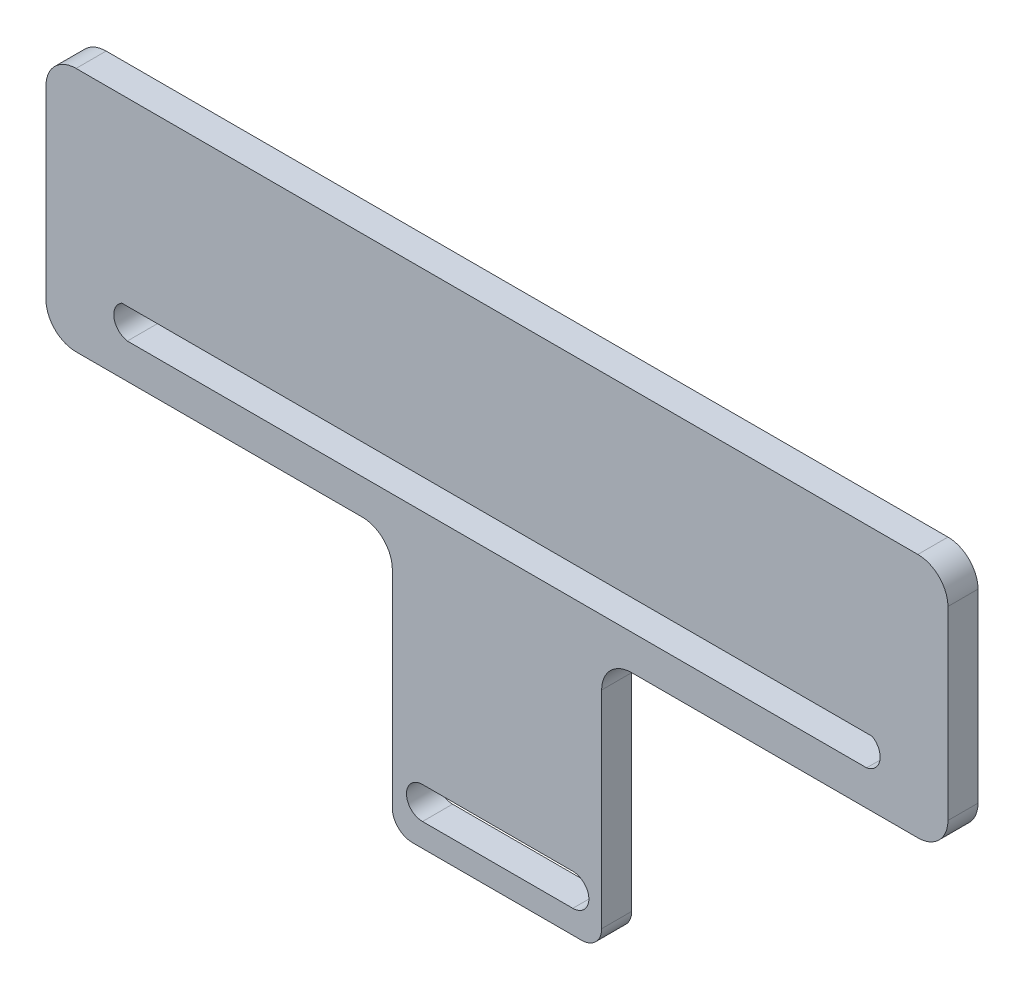
ISO-10303-21;
HEADER;
FILE_DESCRIPTION(('STEP AP214'),'2;1');
FILE_NAME('part.step','',(''),(''),'','','');
FILE_SCHEMA(('AUTOMOTIVE_DESIGN { 1 0 10303 214 1 1 1 1 }'));
ENDSEC;
DATA;
#1=APPLICATION_CONTEXT('core data for automotive mechanical design processes');
#2=APPLICATION_PROTOCOL_DEFINITION('international standard','automotive_design',2000,#1);
#3=PRODUCT_CONTEXT('',#1,'mechanical');
#4=PRODUCT('Part','Part','',(#3));
#5=PRODUCT_RELATED_PRODUCT_CATEGORY('part','',(#4));
#6=PRODUCT_DEFINITION_FORMATION('','',#4);
#7=PRODUCT_DEFINITION_CONTEXT('part definition',#1,'design');
#8=PRODUCT_DEFINITION('design','',#6,#7);
#9=PRODUCT_DEFINITION_SHAPE('','',#8);
#10=(LENGTH_UNIT() NAMED_UNIT(*) SI_UNIT(.MILLI.,.METRE.));
#11=(NAMED_UNIT(*) PLANE_ANGLE_UNIT() SI_UNIT($,.RADIAN.));
#12=(NAMED_UNIT(*) SI_UNIT($,.STERADIAN.) SOLID_ANGLE_UNIT());
#13=UNCERTAINTY_MEASURE_WITH_UNIT(LENGTH_MEASURE(1.E-05),#10,'distance_accuracy_value','');
#14=(GEOMETRIC_REPRESENTATION_CONTEXT(3) GLOBAL_UNCERTAINTY_ASSIGNED_CONTEXT((#13)) GLOBAL_UNIT_ASSIGNED_CONTEXT((#10,
#11,#12)) REPRESENTATION_CONTEXT('',''));
#15=CARTESIAN_POINT('',(0.,0.,0.));
#16=DIRECTION('',(0.,0.,1.));
#17=DIRECTION('',(1.,0.,0.));
#18=AXIS2_PLACEMENT_3D('',#15,#16,#17);
#19=CARTESIAN_POINT('',(13.443741515175,18.7024349270846,3.));
#20=DIRECTION('',(0.,0.,-1.));
#21=DIRECTION('',(-1.,0.,0.));
#22=AXIS2_PLACEMENT_3D('',#19,#20,#21);
#23=PLANE('',#22);
#24=CARTESIAN_POINT('',(-7.43073465550234,0.,3.));
#25=DIRECTION('',(0.,0.,1.));
#26=DIRECTION('',(1.,0.,0.));
#27=AXIS2_PLACEMENT_3D('',#24,#25,#26);
#28=CIRCLE('',#27,1.6);
#29=CARTESIAN_POINT('',(-7.43073465550234,1.6,3.));
#30=VERTEX_POINT('',#29);
#31=CARTESIAN_POINT('',(-7.43073465550234,-1.6,3.));
#32=VERTEX_POINT('',#31);
#33=EDGE_CURVE('E236',#30,#32,#28,.T.);
#34=ORIENTED_EDGE('',*,*,#33,.F.);
#35=DIRECTION('',(-1.,0.,0.));
#36=VECTOR('',#35,1.);
#37=CARTESIAN_POINT('',(-7.43073465550234,1.6,3.));
#38=LINE('',#37,#36);
#39=CARTESIAN_POINT('',(7.56926534449766,1.6,3.));
#40=VERTEX_POINT('',#39);
#41=EDGE_CURVE('E244',#40,#30,#38,.T.);
#42=ORIENTED_EDGE('',*,*,#41,.F.);
#43=CARTESIAN_POINT('',(7.56926534449766,0.,3.));
#44=DIRECTION('',(0.,0.,1.));
#45=DIRECTION('',(1.,0.,0.));
#46=AXIS2_PLACEMENT_3D('',#43,#44,#45);
#47=CIRCLE('',#46,1.6);
#48=CARTESIAN_POINT('',(7.56926534449766,-1.6,3.));
#49=VERTEX_POINT('',#48);
#50=EDGE_CURVE('E241',#49,#40,#47,.T.);
#51=ORIENTED_EDGE('',*,*,#50,.F.);
#52=DIRECTION('',(1.,0.,0.));
#53=VECTOR('',#52,1.);
#54=CARTESIAN_POINT('',(-7.43073465550234,-1.6,3.));
#55=LINE('',#54,#53);
#56=EDGE_CURVE('E238',#32,#49,#55,.T.);
#57=ORIENTED_EDGE('',*,*,#56,.F.);
#58=EDGE_LOOP('',(#34,#42,#51,#57));
#59=FACE_BOUND('',#58,.T.);
#60=DIRECTION('',(0.,1.,0.));
#61=VECTOR('',#60,1.);
#62=CARTESIAN_POINT('',(10.443741515175,1.70243492708456,3.));
#63=LINE('',#62,#61);
#64=CARTESIAN_POINT('',(10.443741515175,-1.92883744754202,3.));
#65=VERTEX_POINT('',#64);
#66=CARTESIAN_POINT('',(10.443741515175,18.7024349270845,3.));
#67=VERTEX_POINT('',#66);
#68=EDGE_CURVE('E267',#65,#67,#63,.T.);
#69=ORIENTED_EDGE('',*,*,#68,.T.);
#70=CARTESIAN_POINT('',(13.443741515175,18.7024349270846,3.));
#71=DIRECTION('',(0.,0.,-1.));
#72=DIRECTION('',(-1.,0.,0.));
#73=AXIS2_PLACEMENT_3D('',#70,#71,#72);
#74=CIRCLE('',#73,3.);
#75=CARTESIAN_POINT('',(13.443741515175,21.7024349270846,3.));
#76=VERTEX_POINT('',#75);
#77=EDGE_CURVE('E270',#67,#76,#74,.T.);
#78=ORIENTED_EDGE('',*,*,#77,.T.);
#79=DIRECTION('',(1.,0.,0.));
#80=VECTOR('',#79,1.);
#81=CARTESIAN_POINT('',(13.443741515175,21.7024349270846,3.));
#82=LINE('',#81,#80);
#83=CARTESIAN_POINT('',(42.,21.7024349270846,3.));
#84=VERTEX_POINT('',#83);
#85=EDGE_CURVE('E273',#76,#84,#82,.T.);
#86=ORIENTED_EDGE('',*,*,#85,.T.);
#87=CARTESIAN_POINT('',(42.,24.7024349270846,3.));
#88=DIRECTION('',(0.,0.,1.));
#89=DIRECTION('',(1.,0.,0.));
#90=AXIS2_PLACEMENT_3D('',#87,#88,#89);
#91=CIRCLE('',#90,3.);
#92=CARTESIAN_POINT('',(45.,24.7024349270846,3.));
#93=VERTEX_POINT('',#92);
#94=EDGE_CURVE('E275',#84,#93,#91,.T.);
#95=ORIENTED_EDGE('',*,*,#94,.T.);
#96=DIRECTION('',(0.,1.,0.));
#97=VECTOR('',#96,1.);
#98=CARTESIAN_POINT('',(45.,24.7024349270846,3.));
#99=LINE('',#98,#97);
#100=CARTESIAN_POINT('',(45.,43.1965099268316,3.));
#101=VERTEX_POINT('',#100);
#102=EDGE_CURVE('E277',#93,#101,#99,.T.);
#103=ORIENTED_EDGE('',*,*,#102,.T.);
#104=CARTESIAN_POINT('',(42.,43.1965099268316,3.));
#105=DIRECTION('',(0.,0.,1.));
#106=DIRECTION('',(1.,0.,0.));
#107=AXIS2_PLACEMENT_3D('',#104,#105,#106);
#108=CIRCLE('',#107,3.);
#109=CARTESIAN_POINT('',(42.,46.1965099268316,3.));
#110=VERTEX_POINT('',#109);
#111=EDGE_CURVE('E279',#101,#110,#108,.T.);
#112=ORIENTED_EDGE('',*,*,#111,.T.);
#113=DIRECTION('',(-1.,0.,0.));
#114=VECTOR('',#113,1.);
#115=CARTESIAN_POINT('',(-42.,46.1965099268316,3.));
#116=LINE('',#115,#114);
#117=CARTESIAN_POINT('',(-42.,46.1965099268316,3.));
#118=VERTEX_POINT('',#117);
#119=EDGE_CURVE('E281',#110,#118,#116,.T.);
#120=ORIENTED_EDGE('',*,*,#119,.T.);
#121=CARTESIAN_POINT('',(-42.,43.1965099268316,3.));
#122=DIRECTION('',(0.,0.,1.));
#123=DIRECTION('',(-1.,0.,0.));
#124=AXIS2_PLACEMENT_3D('',#121,#122,#123);
#125=CIRCLE('',#124,3.);
#126=CARTESIAN_POINT('',(-45.,43.1965099268316,3.));
#127=VERTEX_POINT('',#126);
#128=EDGE_CURVE('E283',#118,#127,#125,.T.);
#129=ORIENTED_EDGE('',*,*,#128,.T.);
#130=DIRECTION('',(0.,-1.,0.));
#131=VECTOR('',#130,1.);
#132=CARTESIAN_POINT('',(-45.,24.7024349270846,3.));
#133=LINE('',#132,#131);
#134=CARTESIAN_POINT('',(-45.,24.7024349270846,3.));
#135=VERTEX_POINT('',#134);
#136=EDGE_CURVE('E285',#127,#135,#133,.T.);
#137=ORIENTED_EDGE('',*,*,#136,.T.);
#138=CARTESIAN_POINT('',(-42.,24.7024349270846,3.));
#139=DIRECTION('',(0.,0.,1.));
#140=DIRECTION('',(-1.,0.,0.));
#141=AXIS2_PLACEMENT_3D('',#138,#139,#140);
#142=CIRCLE('',#141,3.);
#143=CARTESIAN_POINT('',(-42.,21.7024349270846,3.));
#144=VERTEX_POINT('',#143);
#145=EDGE_CURVE('E287',#135,#144,#142,.T.);
#146=ORIENTED_EDGE('',*,*,#145,.T.);
#147=DIRECTION('',(1.,0.,0.));
#148=VECTOR('',#147,1.);
#149=CARTESIAN_POINT('',(-13.443741515175,21.7024349270846,3.));
#150=LINE('',#149,#148);
#151=CARTESIAN_POINT('',(-13.443741515175,21.7024349270846,3.));
#152=VERTEX_POINT('',#151);
#153=EDGE_CURVE('E289',#144,#152,#150,.T.);
#154=ORIENTED_EDGE('',*,*,#153,.T.);
#155=CARTESIAN_POINT('',(-13.443741515175,18.7024349270846,3.));
#156=DIRECTION('',(0.,0.,-1.));
#157=DIRECTION('',(1.,0.,0.));
#158=AXIS2_PLACEMENT_3D('',#155,#156,#157);
#159=CIRCLE('',#158,3.);
#160=CARTESIAN_POINT('',(-10.443741515175,18.7024349270845,3.));
#161=VERTEX_POINT('',#160);
#162=EDGE_CURVE('E291',#152,#161,#159,.T.);
#163=ORIENTED_EDGE('',*,*,#162,.T.);
#164=DIRECTION('',(0.,-1.,0.));
#165=VECTOR('',#164,1.);
#166=CARTESIAN_POINT('',(-10.443741515175,1.70243492708456,3.));
#167=LINE('',#166,#165);
#168=CARTESIAN_POINT('',(-10.443741515175,-1.92883744754203,3.));
#169=VERTEX_POINT('',#168);
#170=EDGE_CURVE('E293',#161,#169,#167,.T.);
#171=ORIENTED_EDGE('',*,*,#170,.T.);
#172=CARTESIAN_POINT('',(-8.44374151517498,-1.92883744754203,3.));
#173=DIRECTION('',(0.,0.,1.));
#174=DIRECTION('',(-1.,0.,0.));
#175=AXIS2_PLACEMENT_3D('',#172,#173,#174);
#176=CIRCLE('',#175,2.);
#177=CARTESIAN_POINT('',(-8.44374151517498,-3.92883744754203,3.));
#178=VERTEX_POINT('',#177);
#179=EDGE_CURVE('E295',#169,#178,#176,.T.);
#180=ORIENTED_EDGE('',*,*,#179,.T.);
#181=DIRECTION('',(1.,0.,0.));
#182=VECTOR('',#181,1.);
#183=CARTESIAN_POINT('',(-8.44374151517498,-3.92883744754203,3.));
#184=LINE('',#183,#182);
#185=CARTESIAN_POINT('',(8.44374151517499,-3.92883744754202,3.));
#186=VERTEX_POINT('',#185);
#187=EDGE_CURVE('E297',#178,#186,#184,.T.);
#188=ORIENTED_EDGE('',*,*,#187,.T.);
#189=CARTESIAN_POINT('',(8.44374151517499,-1.92883744754202,3.));
#190=DIRECTION('',(0.,0.,1.));
#191=DIRECTION('',(1.,0.,0.));
#192=AXIS2_PLACEMENT_3D('',#189,#190,#191);
#193=CIRCLE('',#192,2.);
#194=EDGE_CURVE('E299',#186,#65,#193,.T.);
#195=ORIENTED_EDGE('',*,*,#194,.T.);
#196=EDGE_LOOP('',(#69,#78,#86,#95,#103,#112,#120,#129,#137,#146,#154,#163,#171,#180,#188,#195));
#197=FACE_BOUND('',#196,.T.);
#198=CARTESIAN_POINT('',(-36.6103634335643,26.7996104671066,3.));
#199=DIRECTION('',(0.,0.,1.));
#200=DIRECTION('',(1.,0.,0.));
#201=AXIS2_PLACEMENT_3D('',#198,#199,#200);
#202=CIRCLE('',#201,1.62627400221054);
#203=CARTESIAN_POINT('',(-37.4430932995388,28.1965099268316,3.));
#204=VERTEX_POINT('',#203);
#205=CARTESIAN_POINT('',(-36.8839247393732,25.1965099268316,3.));
#206=VERTEX_POINT('',#205);
#207=EDGE_CURVE('E200',#204,#206,#202,.T.);
#208=ORIENTED_EDGE('',*,*,#207,.F.);
#209=DIRECTION('',(-1.,0.,0.));
#210=VECTOR('',#209,1.);
#211=CARTESIAN_POINT('',(37.4430932995388,28.1965099268316,3.));
#212=LINE('',#211,#210);
#213=CARTESIAN_POINT('',(37.4430932995388,28.1965099268316,3.));
#214=VERTEX_POINT('',#213);
#215=EDGE_CURVE('E222',#214,#204,#212,.T.);
#216=ORIENTED_EDGE('',*,*,#215,.F.);
#217=CARTESIAN_POINT('',(36.6103634335643,26.7996104671066,3.));
#218=DIRECTION('',(0.,0.,1.));
#219=DIRECTION('',(-1.,0.,0.));
#220=AXIS2_PLACEMENT_3D('',#217,#218,#219);
#221=CIRCLE('',#220,1.62627400221054);
#222=CARTESIAN_POINT('',(36.8839247393732,25.1965099268316,3.));
#223=VERTEX_POINT('',#222);
#224=EDGE_CURVE('E220',#223,#214,#221,.T.);
#225=ORIENTED_EDGE('',*,*,#224,.F.);
#226=DIRECTION('',(1.,0.,0.));
#227=VECTOR('',#226,1.);
#228=CARTESIAN_POINT('',(36.8839247393732,25.1965099268316,3.));
#229=LINE('',#228,#227);
#230=EDGE_CURVE('E208',#206,#223,#229,.T.);
#231=ORIENTED_EDGE('',*,*,#230,.F.);
#232=EDGE_LOOP('',(#208,#216,#225,#231));
#233=FACE_BOUND('',#232,.T.);
#234=ADVANCED_FACE('F39',(#59,#197,#233),#23,.F.);
#235=CARTESIAN_POINT('',(13.443741515175,18.7024349270846,0.));
#236=DIRECTION('',(0.,0.,-1.));
#237=DIRECTION('',(-1.,0.,0.));
#238=AXIS2_PLACEMENT_3D('',#235,#236,#237);
#239=PLANE('',#238);
#240=CARTESIAN_POINT('',(13.443741515175,18.7024349270846,0.));
#241=DIRECTION('',(0.,0.,-1.));
#242=DIRECTION('',(-1.,0.,0.));
#243=AXIS2_PLACEMENT_3D('',#240,#241,#242);
#244=CIRCLE('',#243,3.);
#245=CARTESIAN_POINT('',(10.443741515175,18.7024349270845,0.));
#246=VERTEX_POINT('',#245);
#247=CARTESIAN_POINT('',(13.443741515175,21.7024349270846,0.));
#248=VERTEX_POINT('',#247);
#249=EDGE_CURVE('E266',#246,#248,#244,.T.);
#250=ORIENTED_EDGE('',*,*,#249,.F.);
#251=DIRECTION('',(0.,1.,0.));
#252=VECTOR('',#251,1.);
#253=CARTESIAN_POINT('',(10.443741515175,-1.92883744754202,0.));
#254=LINE('',#253,#252);
#255=CARTESIAN_POINT('',(10.443741515175,-1.92883744754202,0.));
#256=VERTEX_POINT('',#255);
#257=EDGE_CURVE('E271',#256,#246,#254,.T.);
#258=ORIENTED_EDGE('',*,*,#257,.F.);
#259=CARTESIAN_POINT('',(8.44374151517499,-1.92883744754202,0.));
#260=DIRECTION('',(0.,0.,1.));
#261=DIRECTION('',(1.,0.,0.));
#262=AXIS2_PLACEMENT_3D('',#259,#260,#261);
#263=CIRCLE('',#262,2.);
#264=CARTESIAN_POINT('',(8.44374151517499,-3.92883744754202,0.));
#265=VERTEX_POINT('',#264);
#266=EDGE_CURVE('E331',#265,#256,#263,.T.);
#267=ORIENTED_EDGE('',*,*,#266,.F.);
#268=DIRECTION('',(1.,0.,0.));
#269=VECTOR('',#268,1.);
#270=CARTESIAN_POINT('',(-8.44374151517498,-3.92883744754203,0.));
#271=LINE('',#270,#269);
#272=CARTESIAN_POINT('',(-8.44374151517498,-3.92883744754203,0.));
#273=VERTEX_POINT('',#272);
#274=EDGE_CURVE('E329',#273,#265,#271,.T.);
#275=ORIENTED_EDGE('',*,*,#274,.F.);
#276=CARTESIAN_POINT('',(-8.44374151517498,-1.92883744754203,0.));
#277=DIRECTION('',(0.,0.,1.));
#278=DIRECTION('',(-1.,0.,0.));
#279=AXIS2_PLACEMENT_3D('',#276,#277,#278);
#280=CIRCLE('',#279,2.);
#281=CARTESIAN_POINT('',(-10.443741515175,-1.92883744754203,0.));
#282=VERTEX_POINT('',#281);
#283=EDGE_CURVE('E327',#282,#273,#280,.T.);
#284=ORIENTED_EDGE('',*,*,#283,.F.);
#285=DIRECTION('',(0.,-1.,0.));
#286=VECTOR('',#285,1.);
#287=CARTESIAN_POINT('',(-10.443741515175,-1.92883744754203,0.));
#288=LINE('',#287,#286);
#289=CARTESIAN_POINT('',(-10.443741515175,18.7024349270845,0.));
#290=VERTEX_POINT('',#289);
#291=EDGE_CURVE('E325',#290,#282,#288,.T.);
#292=ORIENTED_EDGE('',*,*,#291,.F.);
#293=CARTESIAN_POINT('',(-13.443741515175,18.7024349270846,0.));
#294=DIRECTION('',(0.,0.,-1.));
#295=DIRECTION('',(1.,0.,0.));
#296=AXIS2_PLACEMENT_3D('',#293,#294,#295);
#297=CIRCLE('',#296,3.);
#298=CARTESIAN_POINT('',(-13.443741515175,21.7024349270846,0.));
#299=VERTEX_POINT('',#298);
#300=EDGE_CURVE('E322',#299,#290,#297,.T.);
#301=ORIENTED_EDGE('',*,*,#300,.F.);
#302=DIRECTION('',(1.,0.,0.));
#303=VECTOR('',#302,1.);
#304=CARTESIAN_POINT('',(-13.443741515175,21.7024349270846,0.));
#305=LINE('',#304,#303);
#306=CARTESIAN_POINT('',(-42.,21.7024349270846,0.));
#307=VERTEX_POINT('',#306);
#308=EDGE_CURVE('E320',#307,#299,#305,.T.);
#309=ORIENTED_EDGE('',*,*,#308,.F.);
#310=CARTESIAN_POINT('',(-42.,24.7024349270846,0.));
#311=DIRECTION('',(0.,0.,1.));
#312=DIRECTION('',(-1.,0.,0.));
#313=AXIS2_PLACEMENT_3D('',#310,#311,#312);
#314=CIRCLE('',#313,3.);
#315=CARTESIAN_POINT('',(-45.,24.7024349270846,0.));
#316=VERTEX_POINT('',#315);
#317=EDGE_CURVE('E318',#316,#307,#314,.T.);
#318=ORIENTED_EDGE('',*,*,#317,.F.);
#319=DIRECTION('',(0.,-1.,0.));
#320=VECTOR('',#319,1.);
#321=CARTESIAN_POINT('',(-45.,24.7024349270846,0.));
#322=LINE('',#321,#320);
#323=CARTESIAN_POINT('',(-45.,43.1965099268316,0.));
#324=VERTEX_POINT('',#323);
#325=EDGE_CURVE('E316',#324,#316,#322,.T.);
#326=ORIENTED_EDGE('',*,*,#325,.F.);
#327=CARTESIAN_POINT('',(-42.,43.1965099268316,0.));
#328=DIRECTION('',(0.,0.,1.));
#329=DIRECTION('',(-1.,0.,0.));
#330=AXIS2_PLACEMENT_3D('',#327,#328,#329);
#331=CIRCLE('',#330,3.);
#332=CARTESIAN_POINT('',(-42.,46.1965099268316,0.));
#333=VERTEX_POINT('',#332);
#334=EDGE_CURVE('E314',#333,#324,#331,.T.);
#335=ORIENTED_EDGE('',*,*,#334,.F.);
#336=DIRECTION('',(-1.,0.,0.));
#337=VECTOR('',#336,1.);
#338=CARTESIAN_POINT('',(-42.,46.1965099268316,0.));
#339=LINE('',#338,#337);
#340=CARTESIAN_POINT('',(42.,46.1965099268316,0.));
#341=VERTEX_POINT('',#340);
#342=EDGE_CURVE('E312',#341,#333,#339,.T.);
#343=ORIENTED_EDGE('',*,*,#342,.F.);
#344=CARTESIAN_POINT('',(42.,43.1965099268316,0.));
#345=DIRECTION('',(0.,0.,1.));
#346=DIRECTION('',(1.,0.,0.));
#347=AXIS2_PLACEMENT_3D('',#344,#345,#346);
#348=CIRCLE('',#347,3.);
#349=CARTESIAN_POINT('',(45.,43.1965099268316,0.));
#350=VERTEX_POINT('',#349);
#351=EDGE_CURVE('E310',#350,#341,#348,.T.);
#352=ORIENTED_EDGE('',*,*,#351,.F.);
#353=DIRECTION('',(0.,1.,0.));
#354=VECTOR('',#353,1.);
#355=CARTESIAN_POINT('',(45.,24.7024349270846,0.));
#356=LINE('',#355,#354);
#357=CARTESIAN_POINT('',(45.,24.7024349270846,0.));
#358=VERTEX_POINT('',#357);
#359=EDGE_CURVE('E308',#358,#350,#356,.T.);
#360=ORIENTED_EDGE('',*,*,#359,.F.);
#361=CARTESIAN_POINT('',(42.,24.7024349270846,0.));
#362=DIRECTION('',(0.,0.,1.));
#363=DIRECTION('',(1.,0.,0.));
#364=AXIS2_PLACEMENT_3D('',#361,#362,#363);
#365=CIRCLE('',#364,3.);
#366=CARTESIAN_POINT('',(42.,21.7024349270846,0.));
#367=VERTEX_POINT('',#366);
#368=EDGE_CURVE('E306',#367,#358,#365,.T.);
#369=ORIENTED_EDGE('',*,*,#368,.F.);
#370=DIRECTION('',(1.,0.,0.));
#371=VECTOR('',#370,1.);
#372=CARTESIAN_POINT('',(13.443741515175,21.7024349270846,0.));
#373=LINE('',#372,#371);
#374=EDGE_CURVE('E304',#248,#367,#373,.T.);
#375=ORIENTED_EDGE('',*,*,#374,.F.);
#376=EDGE_LOOP('',(#250,#258,#267,#275,#284,#292,#301,#309,#318,#326,#335,#343,#352,#360,#369,#375));
#377=FACE_BOUND('',#376,.T.);
#378=DIRECTION('',(-1.,0.,0.));
#379=VECTOR('',#378,1.);
#380=CARTESIAN_POINT('',(-7.43073465550234,1.6,0.));
#381=LINE('',#380,#379);
#382=CARTESIAN_POINT('',(7.56926534449766,1.6,0.));
#383=VERTEX_POINT('',#382);
#384=CARTESIAN_POINT('',(-7.43073465550234,1.6,0.));
#385=VERTEX_POINT('',#384);
#386=EDGE_CURVE('E239',#383,#385,#381,.T.);
#387=ORIENTED_EDGE('',*,*,#386,.T.);
#388=CARTESIAN_POINT('',(-7.43073465550234,0.,0.));
#389=DIRECTION('',(0.,0.,1.));
#390=DIRECTION('',(1.,0.,0.));
#391=AXIS2_PLACEMENT_3D('',#388,#389,#390);
#392=CIRCLE('',#391,1.6);
#393=CARTESIAN_POINT('',(-7.43073465550234,-1.6,0.));
#394=VERTEX_POINT('',#393);
#395=EDGE_CURVE('E216',#385,#394,#392,.T.);
#396=ORIENTED_EDGE('',*,*,#395,.T.);
#397=DIRECTION('',(1.,0.,0.));
#398=VECTOR('',#397,1.);
#399=CARTESIAN_POINT('',(-7.43073465550234,-1.6,0.));
#400=LINE('',#399,#398);
#401=CARTESIAN_POINT('',(7.56926534449766,-1.6,0.));
#402=VERTEX_POINT('',#401);
#403=EDGE_CURVE('E249',#394,#402,#400,.T.);
#404=ORIENTED_EDGE('',*,*,#403,.T.);
#405=CARTESIAN_POINT('',(7.56926534449766,0.,0.));
#406=DIRECTION('',(0.,0.,1.));
#407=DIRECTION('',(1.,0.,0.));
#408=AXIS2_PLACEMENT_3D('',#405,#406,#407);
#409=CIRCLE('',#408,1.6);
#410=EDGE_CURVE('E252',#402,#383,#409,.T.);
#411=ORIENTED_EDGE('',*,*,#410,.T.);
#412=EDGE_LOOP('',(#387,#396,#404,#411));
#413=FACE_BOUND('',#412,.T.);
#414=DIRECTION('',(-1.,0.,0.));
#415=VECTOR('',#414,1.);
#416=CARTESIAN_POINT('',(37.4430932995388,28.1965099268316,0.));
#417=LINE('',#416,#415);
#418=CARTESIAN_POINT('',(37.4430932995388,28.1965099268316,0.));
#419=VERTEX_POINT('',#418);
#420=CARTESIAN_POINT('',(-37.4430932995388,28.1965099268316,0.));
#421=VERTEX_POINT('',#420);
#422=EDGE_CURVE('E209',#419,#421,#417,.T.);
#423=ORIENTED_EDGE('',*,*,#422,.T.);
#424=CARTESIAN_POINT('',(-36.6103634335643,26.7996104671066,0.));
#425=DIRECTION('',(0.,0.,1.));
#426=DIRECTION('',(1.,0.,0.));
#427=AXIS2_PLACEMENT_3D('',#424,#425,#426);
#428=CIRCLE('',#427,1.62627400221054);
#429=CARTESIAN_POINT('',(-36.8839247393732,25.1965099268316,0.));
#430=VERTEX_POINT('',#429);
#431=EDGE_CURVE('E62',#421,#430,#428,.T.);
#432=ORIENTED_EDGE('',*,*,#431,.T.);
#433=DIRECTION('',(1.,0.,0.));
#434=VECTOR('',#433,1.);
#435=CARTESIAN_POINT('',(36.8839247393732,25.1965099268316,0.));
#436=LINE('',#435,#434);
#437=CARTESIAN_POINT('',(36.8839247393732,25.1965099268316,0.));
#438=VERTEX_POINT('',#437);
#439=EDGE_CURVE('E215',#430,#438,#436,.T.);
#440=ORIENTED_EDGE('',*,*,#439,.T.);
#441=CARTESIAN_POINT('',(36.6103634335643,26.7996104671066,0.));
#442=DIRECTION('',(0.,0.,1.));
#443=DIRECTION('',(-1.,0.,0.));
#444=AXIS2_PLACEMENT_3D('',#441,#442,#443);
#445=CIRCLE('',#444,1.62627400221054);
#446=EDGE_CURVE('E228',#438,#419,#445,.T.);
#447=ORIENTED_EDGE('',*,*,#446,.T.);
#448=EDGE_LOOP('',(#423,#432,#440,#447));
#449=FACE_BOUND('',#448,.T.);
#450=ADVANCED_FACE('F385',(#377,#413,#449),#239,.T.);
#451=CARTESIAN_POINT('',(13.443741515175,18.7024349270846,3.));
#452=DIRECTION('',(0.,0.,-1.));
#453=DIRECTION('',(-1.,0.,0.));
#454=AXIS2_PLACEMENT_3D('',#451,#452,#453);
#455=CYLINDRICAL_SURFACE('',#454,3.);
#456=ORIENTED_EDGE('',*,*,#249,.T.);
#457=DIRECTION('',(0.,0.,-1.));
#458=VECTOR('',#457,1.);
#459=CARTESIAN_POINT('',(13.443741515175,21.7024349270846,3.));
#460=LINE('',#459,#458);
#461=EDGE_CURVE('E47',#76,#248,#460,.T.);
#462=ORIENTED_EDGE('',*,*,#461,.F.);
#463=ORIENTED_EDGE('',*,*,#77,.F.);
#464=DIRECTION('',(0.,0.,-1.));
#465=VECTOR('',#464,1.);
#466=CARTESIAN_POINT('',(10.443741515175,18.7024349270845,3.));
#467=LINE('',#466,#465);
#468=EDGE_CURVE('E11',#67,#246,#467,.T.);
#469=ORIENTED_EDGE('',*,*,#468,.T.);
#470=EDGE_LOOP('',(#456,#462,#463,#469));
#471=FACE_BOUND('',#470,.T.);
#472=ADVANCED_FACE('F41',(#471),#455,.F.);
#473=CARTESIAN_POINT('',(13.443741515175,21.7024349270846,3.));
#474=DIRECTION('',(0.,1.,0.));
#475=DIRECTION('',(-1.,0.,0.));
#476=AXIS2_PLACEMENT_3D('',#473,#474,#475);
#477=PLANE('',#476);
#478=ORIENTED_EDGE('',*,*,#374,.T.);
#479=DIRECTION('',(0.,0.,-1.));
#480=VECTOR('',#479,1.);
#481=CARTESIAN_POINT('',(42.,21.7024349270846,3.));
#482=LINE('',#481,#480);
#483=EDGE_CURVE('E372',#84,#367,#482,.T.);
#484=ORIENTED_EDGE('',*,*,#483,.F.);
#485=ORIENTED_EDGE('',*,*,#85,.F.);
#486=ORIENTED_EDGE('',*,*,#461,.T.);
#487=EDGE_LOOP('',(#478,#484,#485,#486));
#488=FACE_BOUND('',#487,.T.);
#489=ADVANCED_FACE('F379',(#488),#477,.F.);
#490=CARTESIAN_POINT('',(42.,24.7024349270846,3.));
#491=DIRECTION('',(0.,0.,-1.));
#492=DIRECTION('',(-1.,0.,0.));
#493=AXIS2_PLACEMENT_3D('',#490,#491,#492);
#494=CYLINDRICAL_SURFACE('',#493,3.);
#495=ORIENTED_EDGE('',*,*,#368,.T.);
#496=DIRECTION('',(0.,0.,-1.));
#497=VECTOR('',#496,1.);
#498=CARTESIAN_POINT('',(45.,24.7024349270846,3.));
#499=LINE('',#498,#497);
#500=EDGE_CURVE('E369',#93,#358,#499,.T.);
#501=ORIENTED_EDGE('',*,*,#500,.F.);
#502=ORIENTED_EDGE('',*,*,#94,.F.);
#503=ORIENTED_EDGE('',*,*,#483,.T.);
#504=EDGE_LOOP('',(#495,#501,#502,#503));
#505=FACE_BOUND('',#504,.T.);
#506=ADVANCED_FACE('F392',(#505),#494,.T.);
#507=CARTESIAN_POINT('',(45.,24.7024349270846,3.));
#508=DIRECTION('',(-1.,0.,0.));
#509=DIRECTION('',(0.,0.,1.));
#510=AXIS2_PLACEMENT_3D('',#507,#508,#509);
#511=PLANE('',#510);
#512=ORIENTED_EDGE('',*,*,#359,.T.);
#513=DIRECTION('',(0.,0.,-1.));
#514=VECTOR('',#513,1.);
#515=CARTESIAN_POINT('',(45.,43.1965099268316,3.));
#516=LINE('',#515,#514);
#517=EDGE_CURVE('E366',#101,#350,#516,.T.);
#518=ORIENTED_EDGE('',*,*,#517,.F.);
#519=ORIENTED_EDGE('',*,*,#102,.F.);
#520=ORIENTED_EDGE('',*,*,#500,.T.);
#521=EDGE_LOOP('',(#512,#518,#519,#520));
#522=FACE_BOUND('',#521,.T.);
#523=ADVANCED_FACE('F396',(#522),#511,.F.);
#524=CARTESIAN_POINT('',(42.,43.1965099268316,3.));
#525=DIRECTION('',(0.,0.,-1.));
#526=DIRECTION('',(-1.,0.,0.));
#527=AXIS2_PLACEMENT_3D('',#524,#525,#526);
#528=CYLINDRICAL_SURFACE('',#527,3.);
#529=ORIENTED_EDGE('',*,*,#351,.T.);
#530=DIRECTION('',(0.,0.,-1.));
#531=VECTOR('',#530,1.);
#532=CARTESIAN_POINT('',(42.,46.1965099268316,3.));
#533=LINE('',#532,#531);
#534=EDGE_CURVE('E363',#110,#341,#533,.T.);
#535=ORIENTED_EDGE('',*,*,#534,.F.);
#536=ORIENTED_EDGE('',*,*,#111,.F.);
#537=ORIENTED_EDGE('',*,*,#517,.T.);
#538=EDGE_LOOP('',(#529,#535,#536,#537));
#539=FACE_BOUND('',#538,.T.);
#540=ADVANCED_FACE('F454',(#539),#528,.T.);
#541=CARTESIAN_POINT('',(-42.,46.1965099268316,3.));
#542=DIRECTION('',(0.,-1.,0.));
#543=DIRECTION('',(0.,0.,-1.));
#544=AXIS2_PLACEMENT_3D('',#541,#542,#543);
#545=PLANE('',#544);
#546=ORIENTED_EDGE('',*,*,#342,.T.);
#547=DIRECTION('',(0.,0.,-1.));
#548=VECTOR('',#547,1.);
#549=CARTESIAN_POINT('',(-42.,46.1965099268316,3.));
#550=LINE('',#549,#548);
#551=EDGE_CURVE('E360',#118,#333,#550,.T.);
#552=ORIENTED_EDGE('',*,*,#551,.F.);
#553=ORIENTED_EDGE('',*,*,#119,.F.);
#554=ORIENTED_EDGE('',*,*,#534,.T.);
#555=EDGE_LOOP('',(#546,#552,#553,#554));
#556=FACE_BOUND('',#555,.T.);
#557=ADVANCED_FACE('F451',(#556),#545,.F.);
#558=CARTESIAN_POINT('',(-42.,43.1965099268316,3.));
#559=DIRECTION('',(0.,0.,-1.));
#560=DIRECTION('',(-1.,0.,0.));
#561=AXIS2_PLACEMENT_3D('',#558,#559,#560);
#562=CYLINDRICAL_SURFACE('',#561,3.);
#563=ORIENTED_EDGE('',*,*,#334,.T.);
#564=DIRECTION('',(0.,0.,-1.));
#565=VECTOR('',#564,1.);
#566=CARTESIAN_POINT('',(-45.,43.1965099268316,3.));
#567=LINE('',#566,#565);
#568=EDGE_CURVE('E357',#127,#324,#567,.T.);
#569=ORIENTED_EDGE('',*,*,#568,.F.);
#570=ORIENTED_EDGE('',*,*,#128,.F.);
#571=ORIENTED_EDGE('',*,*,#551,.T.);
#572=EDGE_LOOP('',(#563,#569,#570,#571));
#573=FACE_BOUND('',#572,.T.);
#574=ADVANCED_FACE('F447',(#573),#562,.T.);
#575=CARTESIAN_POINT('',(-45.,24.7024349270846,3.));
#576=DIRECTION('',(1.,0.,0.));
#577=DIRECTION('',(0.,0.,-1.));
#578=AXIS2_PLACEMENT_3D('',#575,#576,#577);
#579=PLANE('',#578);
#580=ORIENTED_EDGE('',*,*,#325,.T.);
#581=DIRECTION('',(0.,0.,-1.));
#582=VECTOR('',#581,1.);
#583=CARTESIAN_POINT('',(-45.,24.7024349270846,3.));
#584=LINE('',#583,#582);
#585=EDGE_CURVE('E354',#135,#316,#584,.T.);
#586=ORIENTED_EDGE('',*,*,#585,.F.);
#587=ORIENTED_EDGE('',*,*,#136,.F.);
#588=ORIENTED_EDGE('',*,*,#568,.T.);
#589=EDGE_LOOP('',(#580,#586,#587,#588));
#590=FACE_BOUND('',#589,.T.);
#591=ADVANCED_FACE('F443',(#590),#579,.F.);
#592=CARTESIAN_POINT('',(-42.,24.7024349270846,3.));
#593=DIRECTION('',(0.,0.,-1.));
#594=DIRECTION('',(-1.,0.,0.));
#595=AXIS2_PLACEMENT_3D('',#592,#593,#594);
#596=CYLINDRICAL_SURFACE('',#595,3.);
#597=ORIENTED_EDGE('',*,*,#317,.T.);
#598=DIRECTION('',(0.,0.,-1.));
#599=VECTOR('',#598,1.);
#600=CARTESIAN_POINT('',(-42.,21.7024349270846,3.));
#601=LINE('',#600,#599);
#602=EDGE_CURVE('E351',#144,#307,#601,.T.);
#603=ORIENTED_EDGE('',*,*,#602,.F.);
#604=ORIENTED_EDGE('',*,*,#145,.F.);
#605=ORIENTED_EDGE('',*,*,#585,.T.);
#606=EDGE_LOOP('',(#597,#603,#604,#605));
#607=FACE_BOUND('',#606,.T.);
#608=ADVANCED_FACE('F439',(#607),#596,.T.);
#609=CARTESIAN_POINT('',(-13.443741515175,21.7024349270846,3.));
#610=DIRECTION('',(0.,1.,0.));
#611=DIRECTION('',(-1.,0.,0.));
#612=AXIS2_PLACEMENT_3D('',#609,#610,#611);
#613=PLANE('',#612);
#614=ORIENTED_EDGE('',*,*,#308,.T.);
#615=DIRECTION('',(0.,0.,-1.));
#616=VECTOR('',#615,1.);
#617=CARTESIAN_POINT('',(-13.443741515175,21.7024349270846,3.));
#618=LINE('',#617,#616);
#619=EDGE_CURVE('E348',#152,#299,#618,.T.);
#620=ORIENTED_EDGE('',*,*,#619,.F.);
#621=ORIENTED_EDGE('',*,*,#153,.F.);
#622=ORIENTED_EDGE('',*,*,#602,.T.);
#623=EDGE_LOOP('',(#614,#620,#621,#622));
#624=FACE_BOUND('',#623,.T.);
#625=ADVANCED_FACE('F434',(#624),#613,.F.);
#626=CARTESIAN_POINT('',(-13.443741515175,18.7024349270846,3.));
#627=DIRECTION('',(0.,0.,-1.));
#628=DIRECTION('',(-1.,0.,0.));
#629=AXIS2_PLACEMENT_3D('',#626,#627,#628);
#630=CYLINDRICAL_SURFACE('',#629,3.);
#631=ORIENTED_EDGE('',*,*,#300,.T.);
#632=DIRECTION('',(0.,0.,-1.));
#633=VECTOR('',#632,1.);
#634=CARTESIAN_POINT('',(-10.443741515175,18.7024349270845,3.));
#635=LINE('',#634,#633);
#636=EDGE_CURVE('E345',#161,#290,#635,.T.);
#637=ORIENTED_EDGE('',*,*,#636,.F.);
#638=ORIENTED_EDGE('',*,*,#162,.F.);
#639=ORIENTED_EDGE('',*,*,#619,.T.);
#640=EDGE_LOOP('',(#631,#637,#638,#639));
#641=FACE_BOUND('',#640,.T.);
#642=ADVANCED_FACE('F425',(#641),#630,.F.);
#643=CARTESIAN_POINT('',(-10.443741515175,-1.92883744754203,3.));
#644=DIRECTION('',(1.,0.,0.));
#645=DIRECTION('',(0.,0.,-1.));
#646=AXIS2_PLACEMENT_3D('',#643,#644,#645);
#647=PLANE('',#646);
#648=ORIENTED_EDGE('',*,*,#291,.T.);
#649=DIRECTION('',(0.,0.,-1.));
#650=VECTOR('',#649,1.);
#651=CARTESIAN_POINT('',(-10.443741515175,-1.92883744754203,3.));
#652=LINE('',#651,#650);
#653=EDGE_CURVE('E342',#169,#282,#652,.T.);
#654=ORIENTED_EDGE('',*,*,#653,.F.);
#655=ORIENTED_EDGE('',*,*,#170,.F.);
#656=ORIENTED_EDGE('',*,*,#636,.T.);
#657=EDGE_LOOP('',(#648,#654,#655,#656));
#658=FACE_BOUND('',#657,.T.);
#659=ADVANCED_FACE('F429',(#658),#647,.F.);
#660=CARTESIAN_POINT('',(-8.44374151517498,-1.92883744754203,3.));
#661=DIRECTION('',(0.,0.,-1.));
#662=DIRECTION('',(-1.,0.,0.));
#663=AXIS2_PLACEMENT_3D('',#660,#661,#662);
#664=CYLINDRICAL_SURFACE('',#663,2.);
#665=ORIENTED_EDGE('',*,*,#283,.T.);
#666=DIRECTION('',(0.,0.,-1.));
#667=VECTOR('',#666,1.);
#668=CARTESIAN_POINT('',(-8.44374151517498,-3.92883744754203,3.));
#669=LINE('',#668,#667);
#670=EDGE_CURVE('E339',#178,#273,#669,.T.);
#671=ORIENTED_EDGE('',*,*,#670,.F.);
#672=ORIENTED_EDGE('',*,*,#179,.F.);
#673=ORIENTED_EDGE('',*,*,#653,.T.);
#674=EDGE_LOOP('',(#665,#671,#672,#673));
#675=FACE_BOUND('',#674,.T.);
#676=ADVANCED_FACE('F418',(#675),#664,.T.);
#677=CARTESIAN_POINT('',(-8.44374151517498,-3.92883744754203,3.));
#678=DIRECTION('',(0.,1.,0.));
#679=DIRECTION('',(-1.,0.,0.));
#680=AXIS2_PLACEMENT_3D('',#677,#678,#679);
#681=PLANE('',#680);
#682=ORIENTED_EDGE('',*,*,#274,.T.);
#683=DIRECTION('',(0.,0.,-1.));
#684=VECTOR('',#683,1.);
#685=CARTESIAN_POINT('',(8.44374151517499,-3.92883744754202,3.));
#686=LINE('',#685,#684);
#687=EDGE_CURVE('E336',#186,#265,#686,.T.);
#688=ORIENTED_EDGE('',*,*,#687,.F.);
#689=ORIENTED_EDGE('',*,*,#187,.F.);
#690=ORIENTED_EDGE('',*,*,#670,.T.);
#691=EDGE_LOOP('',(#682,#688,#689,#690));
#692=FACE_BOUND('',#691,.T.);
#693=ADVANCED_FACE('F414',(#692),#681,.F.);
#694=CARTESIAN_POINT('',(8.44374151517499,-1.92883744754202,3.));
#695=DIRECTION('',(0.,0.,-1.));
#696=DIRECTION('',(-1.,0.,0.));
#697=AXIS2_PLACEMENT_3D('',#694,#695,#696);
#698=CYLINDRICAL_SURFACE('',#697,2.);
#699=ORIENTED_EDGE('',*,*,#266,.T.);
#700=DIRECTION('',(0.,0.,-1.));
#701=VECTOR('',#700,1.);
#702=CARTESIAN_POINT('',(10.443741515175,-1.92883744754202,3.));
#703=LINE('',#702,#701);
#704=EDGE_CURVE('E302',#65,#256,#703,.T.);
#705=ORIENTED_EDGE('',*,*,#704,.F.);
#706=ORIENTED_EDGE('',*,*,#194,.F.);
#707=ORIENTED_EDGE('',*,*,#687,.T.);
#708=EDGE_LOOP('',(#699,#705,#706,#707));
#709=FACE_BOUND('',#708,.T.);
#710=ADVANCED_FACE('F409',(#709),#698,.T.);
#711=CARTESIAN_POINT('',(10.443741515175,-1.92883744754202,3.));
#712=DIRECTION('',(-1.,0.,0.));
#713=DIRECTION('',(0.,-1.,0.));
#714=AXIS2_PLACEMENT_3D('',#711,#712,#713);
#715=PLANE('',#714);
#716=ORIENTED_EDGE('',*,*,#257,.T.);
#717=ORIENTED_EDGE('',*,*,#468,.F.);
#718=ORIENTED_EDGE('',*,*,#68,.F.);
#719=ORIENTED_EDGE('',*,*,#704,.T.);
#720=EDGE_LOOP('',(#716,#717,#718,#719));
#721=FACE_BOUND('',#720,.T.);
#722=ADVANCED_FACE('F403',(#721),#715,.F.);
#723=CARTESIAN_POINT('',(-7.43073465550234,0.,3.));
#724=DIRECTION('',(0.,0.,-1.));
#725=DIRECTION('',(-1.,0.,0.));
#726=AXIS2_PLACEMENT_3D('',#723,#724,#725);
#727=CYLINDRICAL_SURFACE('',#726,1.6);
#728=ORIENTED_EDGE('',*,*,#395,.F.);
#729=DIRECTION('',(0.,0.,-1.));
#730=VECTOR('',#729,1.);
#731=CARTESIAN_POINT('',(-7.43073465550234,1.6,3.));
#732=LINE('',#731,#730);
#733=EDGE_CURVE('E246',#30,#385,#732,.T.);
#734=ORIENTED_EDGE('',*,*,#733,.F.);
#735=ORIENTED_EDGE('',*,*,#33,.T.);
#736=DIRECTION('',(0.,0.,-1.));
#737=VECTOR('',#736,1.);
#738=CARTESIAN_POINT('',(-7.43073465550234,-1.6,3.));
#739=LINE('',#738,#737);
#740=EDGE_CURVE('E263',#32,#394,#739,.T.);
#741=ORIENTED_EDGE('',*,*,#740,.T.);
#742=EDGE_LOOP('',(#728,#734,#735,#741));
#743=FACE_BOUND('',#742,.T.);
#744=ADVANCED_FACE('F472',(#743),#727,.F.);
#745=CARTESIAN_POINT('',(-7.43073465550234,-1.6,3.));
#746=DIRECTION('',(0.,1.,0.));
#747=DIRECTION('',(0.,0.,1.));
#748=AXIS2_PLACEMENT_3D('',#745,#746,#747);
#749=PLANE('',#748);
#750=ORIENTED_EDGE('',*,*,#403,.F.);
#751=ORIENTED_EDGE('',*,*,#740,.F.);
#752=ORIENTED_EDGE('',*,*,#56,.T.);
#753=DIRECTION('',(0.,0.,-1.));
#754=VECTOR('',#753,1.);
#755=CARTESIAN_POINT('',(7.56926534449766,-1.6,3.));
#756=LINE('',#755,#754);
#757=EDGE_CURVE('E261',#49,#402,#756,.T.);
#758=ORIENTED_EDGE('',*,*,#757,.T.);
#759=EDGE_LOOP('',(#750,#751,#752,#758));
#760=FACE_BOUND('',#759,.T.);
#761=ADVANCED_FACE('F540',(#760),#749,.T.);
#762=CARTESIAN_POINT('',(7.56926534449766,0.,3.));
#763=DIRECTION('',(0.,0.,-1.));
#764=DIRECTION('',(-1.,0.,0.));
#765=AXIS2_PLACEMENT_3D('',#762,#763,#764);
#766=CYLINDRICAL_SURFACE('',#765,1.6);
#767=ORIENTED_EDGE('',*,*,#410,.F.);
#768=ORIENTED_EDGE('',*,*,#757,.F.);
#769=ORIENTED_EDGE('',*,*,#50,.T.);
#770=DIRECTION('',(0.,0.,-1.));
#771=VECTOR('',#770,1.);
#772=CARTESIAN_POINT('',(7.56926534449766,1.6,3.));
#773=LINE('',#772,#771);
#774=EDGE_CURVE('E259',#40,#383,#773,.T.);
#775=ORIENTED_EDGE('',*,*,#774,.T.);
#776=EDGE_LOOP('',(#767,#768,#769,#775));
#777=FACE_BOUND('',#776,.T.);
#778=ADVANCED_FACE('F547',(#777),#766,.F.);
#779=CARTESIAN_POINT('',(-7.43073465550234,1.6,3.));
#780=DIRECTION('',(0.,-1.,0.));
#781=DIRECTION('',(0.,0.,-1.));
#782=AXIS2_PLACEMENT_3D('',#779,#780,#781);
#783=PLANE('',#782);
#784=ORIENTED_EDGE('',*,*,#386,.F.);
#785=ORIENTED_EDGE('',*,*,#774,.F.);
#786=ORIENTED_EDGE('',*,*,#41,.T.);
#787=ORIENTED_EDGE('',*,*,#733,.T.);
#788=EDGE_LOOP('',(#784,#785,#786,#787));
#789=FACE_BOUND('',#788,.T.);
#790=ADVANCED_FACE('F554',(#789),#783,.T.);
#791=CARTESIAN_POINT('',(-36.6103634335643,26.7996104671066,3.));
#792=DIRECTION('',(0.,0.,-1.));
#793=DIRECTION('',(-1.,0.,0.));
#794=AXIS2_PLACEMENT_3D('',#791,#792,#793);
#795=CYLINDRICAL_SURFACE('',#794,1.62627400221054);
#796=ORIENTED_EDGE('',*,*,#431,.F.);
#797=DIRECTION('',(0.,0.,-1.));
#798=VECTOR('',#797,1.);
#799=CARTESIAN_POINT('',(-37.4430932995388,28.1965099268316,3.));
#800=LINE('',#799,#798);
#801=EDGE_CURVE('E204',#204,#421,#800,.T.);
#802=ORIENTED_EDGE('',*,*,#801,.F.);
#803=ORIENTED_EDGE('',*,*,#207,.T.);
#804=DIRECTION('',(0.,0.,-1.));
#805=VECTOR('',#804,1.);
#806=CARTESIAN_POINT('',(-36.8839247393732,25.1965099268316,3.));
#807=LINE('',#806,#805);
#808=EDGE_CURVE('E203',#206,#430,#807,.T.);
#809=ORIENTED_EDGE('',*,*,#808,.T.);
#810=EDGE_LOOP('',(#796,#802,#803,#809));
#811=FACE_BOUND('',#810,.T.);
#812=ADVANCED_FACE('F202',(#811),#795,.F.);
#813=CARTESIAN_POINT('',(36.8839247393732,25.1965099268316,3.));
#814=DIRECTION('',(0.,1.,0.));
#815=DIRECTION('',(0.,0.,1.));
#816=AXIS2_PLACEMENT_3D('',#813,#814,#815);
#817=PLANE('',#816);
#818=ORIENTED_EDGE('',*,*,#439,.F.);
#819=ORIENTED_EDGE('',*,*,#808,.F.);
#820=ORIENTED_EDGE('',*,*,#230,.T.);
#821=DIRECTION('',(0.,0.,-1.));
#822=VECTOR('',#821,1.);
#823=CARTESIAN_POINT('',(36.8839247393732,25.1965099268316,3.));
#824=LINE('',#823,#822);
#825=EDGE_CURVE('E217',#223,#438,#824,.T.);
#826=ORIENTED_EDGE('',*,*,#825,.T.);
#827=EDGE_LOOP('',(#818,#819,#820,#826));
#828=FACE_BOUND('',#827,.T.);
#829=ADVANCED_FACE('F212',(#828),#817,.T.);
#830=CARTESIAN_POINT('',(36.6103634335643,26.7996104671066,3.));
#831=DIRECTION('',(0.,0.,-1.));
#832=DIRECTION('',(-1.,0.,0.));
#833=AXIS2_PLACEMENT_3D('',#830,#831,#832);
#834=CYLINDRICAL_SURFACE('',#833,1.62627400221054);
#835=ORIENTED_EDGE('',*,*,#446,.F.);
#836=ORIENTED_EDGE('',*,*,#825,.F.);
#837=ORIENTED_EDGE('',*,*,#224,.T.);
#838=DIRECTION('',(0.,0.,-1.));
#839=VECTOR('',#838,1.);
#840=CARTESIAN_POINT('',(37.4430932995388,28.1965099268316,3.));
#841=LINE('',#840,#839);
#842=EDGE_CURVE('E54',#214,#419,#841,.T.);
#843=ORIENTED_EDGE('',*,*,#842,.T.);
#844=EDGE_LOOP('',(#835,#836,#837,#843));
#845=FACE_BOUND('',#844,.T.);
#846=ADVANCED_FACE('F575',(#845),#834,.F.);
#847=CARTESIAN_POINT('',(37.4430932995388,28.1965099268316,3.));
#848=DIRECTION('',(0.,-1.,0.));
#849=DIRECTION('',(0.,0.,-1.));
#850=AXIS2_PLACEMENT_3D('',#847,#848,#849);
#851=PLANE('',#850);
#852=ORIENTED_EDGE('',*,*,#422,.F.);
#853=ORIENTED_EDGE('',*,*,#842,.F.);
#854=ORIENTED_EDGE('',*,*,#215,.T.);
#855=ORIENTED_EDGE('',*,*,#801,.T.);
#856=EDGE_LOOP('',(#852,#853,#854,#855));
#857=FACE_BOUND('',#856,.T.);
#858=ADVANCED_FACE('F582',(#857),#851,.T.);
#859=CLOSED_SHELL('',(#234,#450,#472,#489,#506,#523,#540,#557,#574,#591,#608,#625,#642,#659,
#676,#693,#710,#722,#744,#761,#778,#790,#812,#829,#846,#858));
#860=MANIFOLD_SOLID_BREP('B2',#859);
#861=ADVANCED_BREP_SHAPE_REPRESENTATION('',(#18,#860),#14);
#862=SHAPE_DEFINITION_REPRESENTATION(#9,#861);
ENDSEC;
END-ISO-10303-21;
